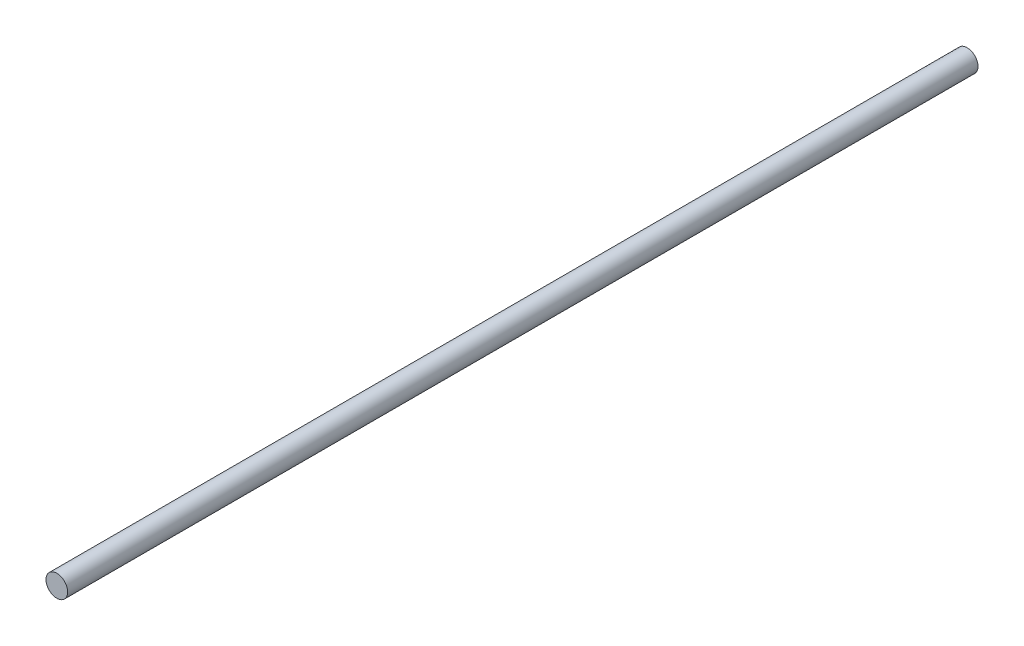
ISO-10303-21;
HEADER;
FILE_DESCRIPTION(('STEP AP214'),'2;1');
FILE_NAME('part.step','',(''),(''),'','','');
FILE_SCHEMA(('AUTOMOTIVE_DESIGN { 1 0 10303 214 1 1 1 1 }'));
ENDSEC;
DATA;
#1=APPLICATION_CONTEXT('core data for automotive mechanical design processes');
#2=APPLICATION_PROTOCOL_DEFINITION('international standard','automotive_design',2000,#1);
#3=PRODUCT_CONTEXT('',#1,'mechanical');
#4=PRODUCT('Part','Part','',(#3));
#5=PRODUCT_RELATED_PRODUCT_CATEGORY('part','',(#4));
#6=PRODUCT_DEFINITION_FORMATION('','',#4);
#7=PRODUCT_DEFINITION_CONTEXT('part definition',#1,'design');
#8=PRODUCT_DEFINITION('design','',#6,#7);
#9=PRODUCT_DEFINITION_SHAPE('','',#8);
#10=(LENGTH_UNIT() NAMED_UNIT(*) SI_UNIT(.MILLI.,.METRE.));
#11=(NAMED_UNIT(*) PLANE_ANGLE_UNIT() SI_UNIT($,.RADIAN.));
#12=(NAMED_UNIT(*) SI_UNIT($,.STERADIAN.) SOLID_ANGLE_UNIT());
#13=UNCERTAINTY_MEASURE_WITH_UNIT(LENGTH_MEASURE(1.E-05),#10,'distance_accuracy_value','');
#14=(GEOMETRIC_REPRESENTATION_CONTEXT(3) GLOBAL_UNCERTAINTY_ASSIGNED_CONTEXT((#13)) GLOBAL_UNIT_ASSIGNED_CONTEXT((#10,
#11,#12)) REPRESENTATION_CONTEXT('',''));
#15=CARTESIAN_POINT('',(0.,0.,0.));
#16=DIRECTION('',(0.,0.,1.));
#17=DIRECTION('',(1.,0.,0.));
#18=AXIS2_PLACEMENT_3D('',#15,#16,#17);
#19=CARTESIAN_POINT('',(0.,0.,-504.));
#20=DIRECTION('',(0.,0.,1.));
#21=DIRECTION('',(1.,0.,0.));
#22=AXIS2_PLACEMENT_3D('',#19,#20,#21);
#23=CYLINDRICAL_SURFACE('',#22,6.);
#24=CARTESIAN_POINT('',(0.,0.,-504.));
#25=DIRECTION('',(0.,0.,1.));
#26=DIRECTION('',(1.,0.,0.));
#27=AXIS2_PLACEMENT_3D('',#24,#25,#26);
#28=CIRCLE('',#27,6.);
#29=CARTESIAN_POINT('',(6.,0.,-504.));
#30=VERTEX_POINT('',#29);
#31=EDGE_CURVE('E10',#30,#30,#28,.T.);
#32=ORIENTED_EDGE('',*,*,#31,.T.);
#33=EDGE_LOOP('',(#32));
#34=FACE_BOUND('',#33,.T.);
#35=CARTESIAN_POINT('',(0.,0.,0.));
#36=DIRECTION('',(0.,0.,1.));
#37=DIRECTION('',(1.,0.,0.));
#38=AXIS2_PLACEMENT_3D('',#35,#36,#37);
#39=CIRCLE('',#38,6.);
#40=CARTESIAN_POINT('',(6.,0.,0.));
#41=VERTEX_POINT('',#40);
#42=EDGE_CURVE('E36',#41,#41,#39,.T.);
#43=ORIENTED_EDGE('',*,*,#42,.F.);
#44=EDGE_LOOP('',(#43));
#45=FACE_BOUND('',#44,.T.);
#46=ADVANCED_FACE('F33',(#34,#45),#23,.T.);
#47=CARTESIAN_POINT('',(0.,0.,-504.));
#48=DIRECTION('',(0.,0.,1.));
#49=DIRECTION('',(1.,0.,0.));
#50=AXIS2_PLACEMENT_3D('',#47,#48,#49);
#51=PLANE('',#50);
#52=ORIENTED_EDGE('',*,*,#31,.F.);
#53=EDGE_LOOP('',(#52));
#54=FACE_BOUND('',#53,.T.);
#55=ADVANCED_FACE('F48',(#54),#51,.F.);
#56=CARTESIAN_POINT('',(0.,0.,0.));
#57=DIRECTION('',(0.,0.,1.));
#58=DIRECTION('',(1.,0.,0.));
#59=AXIS2_PLACEMENT_3D('',#56,#57,#58);
#60=PLANE('',#59);
#61=ORIENTED_EDGE('',*,*,#42,.T.);
#62=EDGE_LOOP('',(#61));
#63=FACE_BOUND('',#62,.T.);
#64=ADVANCED_FACE('F45',(#63),#60,.T.);
#65=CLOSED_SHELL('',(#46,#55,#64));
#66=MANIFOLD_SOLID_BREP('B2',#65);
#67=ADVANCED_BREP_SHAPE_REPRESENTATION('',(#18,#66),#14);
#68=SHAPE_DEFINITION_REPRESENTATION(#9,#67);
ENDSEC;
END-ISO-10303-21;
